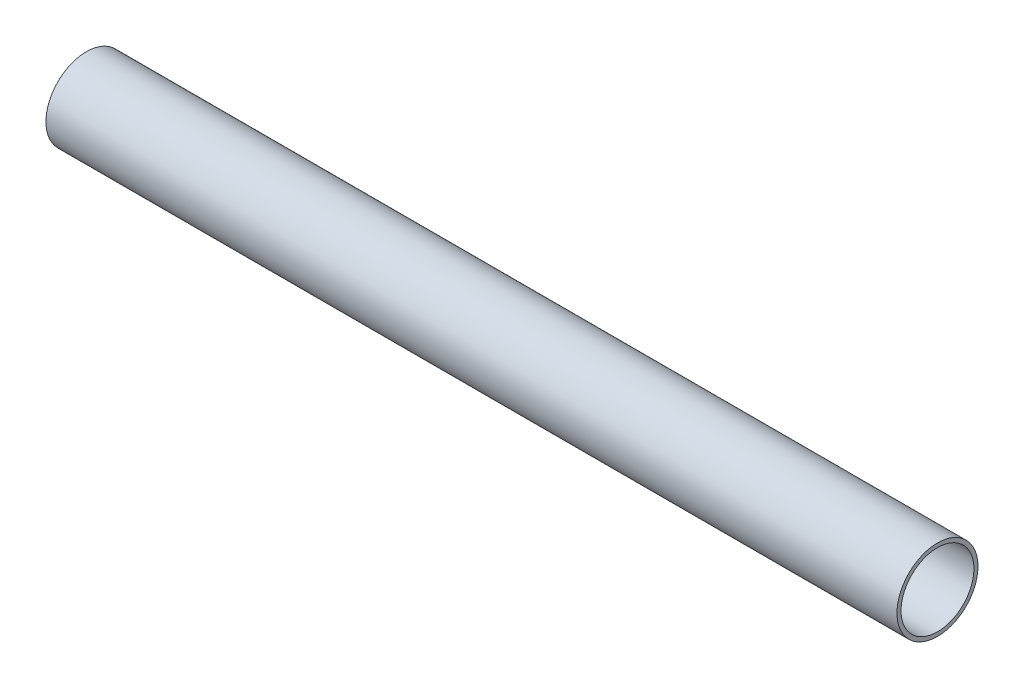
ISO-10303-21;
HEADER;
FILE_DESCRIPTION(('STEP AP214'),'2;1');
FILE_NAME('part.step','',(''),(''),'','','');
FILE_SCHEMA(('AUTOMOTIVE_DESIGN { 1 0 10303 214 1 1 1 1 }'));
ENDSEC;
DATA;
#1=APPLICATION_CONTEXT('core data for automotive mechanical design processes');
#2=APPLICATION_PROTOCOL_DEFINITION('international standard','automotive_design',2000,#1);
#3=PRODUCT_CONTEXT('',#1,'mechanical');
#4=PRODUCT('Part','Part','',(#3));
#5=PRODUCT_RELATED_PRODUCT_CATEGORY('part','',(#4));
#6=PRODUCT_DEFINITION_FORMATION('','',#4);
#7=PRODUCT_DEFINITION_CONTEXT('part definition',#1,'design');
#8=PRODUCT_DEFINITION('design','',#6,#7);
#9=PRODUCT_DEFINITION_SHAPE('','',#8);
#10=(LENGTH_UNIT() NAMED_UNIT(*) SI_UNIT(.MILLI.,.METRE.));
#11=(NAMED_UNIT(*) PLANE_ANGLE_UNIT() SI_UNIT($,.RADIAN.));
#12=(NAMED_UNIT(*) SI_UNIT($,.STERADIAN.) SOLID_ANGLE_UNIT());
#13=UNCERTAINTY_MEASURE_WITH_UNIT(LENGTH_MEASURE(1.E-05),#10,'distance_accuracy_value','');
#14=(GEOMETRIC_REPRESENTATION_CONTEXT(3) GLOBAL_UNCERTAINTY_ASSIGNED_CONTEXT((#13)) GLOBAL_UNIT_ASSIGNED_CONTEXT((#10,
#11,#12)) REPRESENTATION_CONTEXT('',''));
#15=CARTESIAN_POINT('',(0.,0.,0.));
#16=DIRECTION('',(0.,0.,1.));
#17=DIRECTION('',(1.,0.,0.));
#18=AXIS2_PLACEMENT_3D('',#15,#16,#17);
#19=CARTESIAN_POINT('',(166.6875,0.,0.));
#20=DIRECTION('',(1.,0.,0.));
#21=DIRECTION('',(0.,0.,-1.));
#22=AXIS2_PLACEMENT_3D('',#19,#20,#21);
#23=PLANE('',#22);
#24=CARTESIAN_POINT('',(166.6875,0.,0.));
#25=DIRECTION('',(1.,0.,0.));
#26=DIRECTION('',(0.,0.,-1.));
#27=AXIS2_PLACEMENT_3D('',#24,#25,#26);
#28=CIRCLE('',#27,15.875);
#29=CARTESIAN_POINT('',(166.6875,0.,-15.875));
#30=VERTEX_POINT('',#29);
#31=EDGE_CURVE('E11',#30,#30,#28,.T.);
#32=ORIENTED_EDGE('',*,*,#31,.T.);
#33=EDGE_LOOP('',(#32));
#34=FACE_BOUND('',#33,.T.);
#35=CARTESIAN_POINT('',(166.6875,0.,0.));
#36=DIRECTION('',(1.,0.,0.));
#37=DIRECTION('',(0.,0.,-1.));
#38=AXIS2_PLACEMENT_3D('',#35,#36,#37);
#39=CIRCLE('',#38,14.2875);
#40=CARTESIAN_POINT('',(166.6875,0.,-14.2875));
#41=VERTEX_POINT('',#40);
#42=EDGE_CURVE('E52',#41,#41,#39,.T.);
#43=ORIENTED_EDGE('',*,*,#42,.F.);
#44=EDGE_LOOP('',(#43));
#45=FACE_BOUND('',#44,.T.);
#46=ADVANCED_FACE('F41',(#34,#45),#23,.T.);
#47=CARTESIAN_POINT('',(-166.6875,0.,0.));
#48=DIRECTION('',(1.,0.,0.));
#49=DIRECTION('',(0.,0.,-1.));
#50=AXIS2_PLACEMENT_3D('',#47,#48,#49);
#51=PLANE('',#50);
#52=CARTESIAN_POINT('',(-166.6875,0.,0.));
#53=DIRECTION('',(1.,0.,0.));
#54=DIRECTION('',(0.,0.,-1.));
#55=AXIS2_PLACEMENT_3D('',#52,#53,#54);
#56=CIRCLE('',#55,15.875);
#57=CARTESIAN_POINT('',(-166.6875,0.,-15.875));
#58=VERTEX_POINT('',#57);
#59=EDGE_CURVE('E45',#58,#58,#56,.T.);
#60=ORIENTED_EDGE('',*,*,#59,.F.);
#61=EDGE_LOOP('',(#60));
#62=FACE_BOUND('',#61,.T.);
#63=CARTESIAN_POINT('',(-166.6875,0.,0.));
#64=DIRECTION('',(1.,0.,0.));
#65=DIRECTION('',(0.,0.,-1.));
#66=AXIS2_PLACEMENT_3D('',#63,#64,#65);
#67=CIRCLE('',#66,14.2875);
#68=CARTESIAN_POINT('',(-166.6875,0.,-14.2875));
#69=VERTEX_POINT('',#68);
#70=EDGE_CURVE('E54',#69,#69,#67,.T.);
#71=ORIENTED_EDGE('',*,*,#70,.T.);
#72=EDGE_LOOP('',(#71));
#73=FACE_BOUND('',#72,.T.);
#74=ADVANCED_FACE('F64',(#62,#73),#51,.F.);
#75=CARTESIAN_POINT('',(166.6875,0.,0.));
#76=DIRECTION('',(-1.,0.,0.));
#77=DIRECTION('',(0.,0.,1.));
#78=AXIS2_PLACEMENT_3D('',#75,#76,#77);
#79=CYLINDRICAL_SURFACE('',#78,15.875);
#80=ORIENTED_EDGE('',*,*,#31,.F.);
#81=EDGE_LOOP('',(#80));
#82=FACE_BOUND('',#81,.T.);
#83=ORIENTED_EDGE('',*,*,#59,.T.);
#84=EDGE_LOOP('',(#83));
#85=FACE_BOUND('',#84,.T.);
#86=ADVANCED_FACE('F43',(#82,#85),#79,.T.);
#87=CARTESIAN_POINT('',(166.6875,0.,0.));
#88=DIRECTION('',(-1.,0.,0.));
#89=DIRECTION('',(0.,0.,1.));
#90=AXIS2_PLACEMENT_3D('',#87,#88,#89);
#91=CYLINDRICAL_SURFACE('',#90,14.2875);
#92=ORIENTED_EDGE('',*,*,#42,.T.);
#93=EDGE_LOOP('',(#92));
#94=FACE_BOUND('',#93,.T.);
#95=ORIENTED_EDGE('',*,*,#70,.F.);
#96=EDGE_LOOP('',(#95));
#97=FACE_BOUND('',#96,.T.);
#98=ADVANCED_FACE('F60',(#94,#97),#91,.F.);
#99=CLOSED_SHELL('',(#46,#74,#86,#98));
#100=MANIFOLD_SOLID_BREP('B2',#99);
#101=ADVANCED_BREP_SHAPE_REPRESENTATION('',(#18,#100),#14);
#102=SHAPE_DEFINITION_REPRESENTATION(#9,#101);
ENDSEC;
END-ISO-10303-21;
